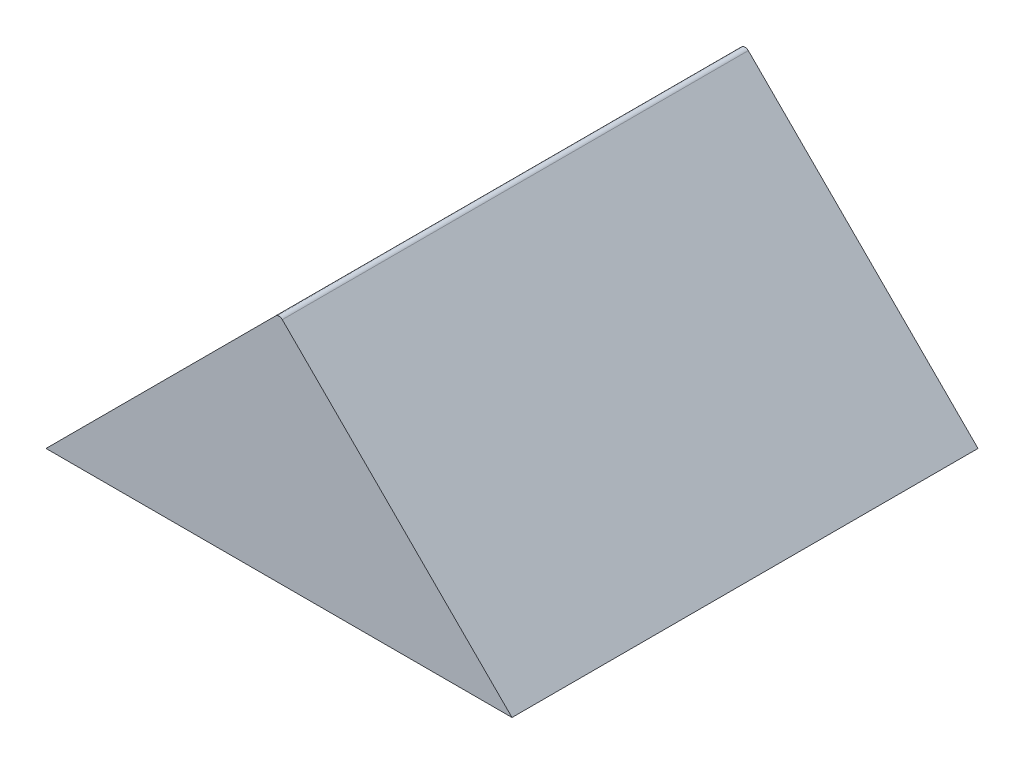
ISO-10303-21;
HEADER;
FILE_DESCRIPTION(('STEP AP214'),'2;1');
FILE_NAME('part.step','',(''),(''),'','','');
FILE_SCHEMA(('AUTOMOTIVE_DESIGN { 1 0 10303 214 1 1 1 1 }'));
ENDSEC;
DATA;
#1=APPLICATION_CONTEXT('core data for automotive mechanical design processes');
#2=APPLICATION_PROTOCOL_DEFINITION('international standard','automotive_design',2000,#1);
#3=PRODUCT_CONTEXT('',#1,'mechanical');
#4=PRODUCT('Part','Part','',(#3));
#5=PRODUCT_RELATED_PRODUCT_CATEGORY('part','',(#4));
#6=PRODUCT_DEFINITION_FORMATION('','',#4);
#7=PRODUCT_DEFINITION_CONTEXT('part definition',#1,'design');
#8=PRODUCT_DEFINITION('design','',#6,#7);
#9=PRODUCT_DEFINITION_SHAPE('','',#8);
#10=(LENGTH_UNIT() NAMED_UNIT(*) SI_UNIT(.MILLI.,.METRE.));
#11=(NAMED_UNIT(*) PLANE_ANGLE_UNIT() SI_UNIT($,.RADIAN.));
#12=(NAMED_UNIT(*) SI_UNIT($,.STERADIAN.) SOLID_ANGLE_UNIT());
#13=UNCERTAINTY_MEASURE_WITH_UNIT(LENGTH_MEASURE(1.E-05),#10,'distance_accuracy_value','');
#14=(GEOMETRIC_REPRESENTATION_CONTEXT(3) GLOBAL_UNCERTAINTY_ASSIGNED_CONTEXT((#13)) GLOBAL_UNIT_ASSIGNED_CONTEXT((#10,
#11,#12)) REPRESENTATION_CONTEXT('',''));
#15=CARTESIAN_POINT('',(0.,0.,0.));
#16=DIRECTION('',(0.,0.,1.));
#17=DIRECTION('',(1.,0.,0.));
#18=AXIS2_PLACEMENT_3D('',#15,#16,#17);
#19=CARTESIAN_POINT('',(-10.,10.,10.));
#20=DIRECTION('',(0.,0.,-1.));
#21=DIRECTION('',(-1.,0.,0.));
#22=AXIS2_PLACEMENT_3D('',#19,#20,#21);
#23=PLANE('',#22);
#24=DIRECTION('',(0.707106781186548,-0.707106781186548,0.));
#25=VECTOR('',#24,1.);
#26=CARTESIAN_POINT('',(10.,0.,10.));
#27=LINE('',#26,#25);
#28=CARTESIAN_POINT('',(0.141421356237308,9.85857864376269,10.));
#29=VERTEX_POINT('',#28);
#30=CARTESIAN_POINT('',(10.,0.,10.));
#31=VERTEX_POINT('',#30);
#32=EDGE_CURVE('E84',#29,#31,#27,.T.);
#33=ORIENTED_EDGE('',*,*,#32,.F.);
#34=CARTESIAN_POINT('',(0.,9.71715728752538,10.));
#35=DIRECTION('',(0.,0.,-1.));
#36=DIRECTION('',(-1.,0.,0.));
#37=AXIS2_PLACEMENT_3D('',#34,#35,#36);
#38=CIRCLE('',#37,0.2);
#39=CARTESIAN_POINT('',(-0.141421356237308,9.85857864376269,10.));
#40=VERTEX_POINT('',#39);
#41=EDGE_CURVE('E55',#29,#40,#38,.F.);
#42=ORIENTED_EDGE('',*,*,#41,.T.);
#43=DIRECTION('',(0.707106781186548,0.707106781186548,0.));
#44=VECTOR('',#43,1.);
#45=CARTESIAN_POINT('',(-10.,0.,10.));
#46=LINE('',#45,#44);
#47=CARTESIAN_POINT('',(-10.,0.,10.));
#48=VERTEX_POINT('',#47);
#49=EDGE_CURVE('E83',#48,#40,#46,.T.);
#50=ORIENTED_EDGE('',*,*,#49,.F.);
#51=DIRECTION('',(1.,0.,0.));
#52=VECTOR('',#51,1.);
#53=CARTESIAN_POINT('',(-10.,0.,10.));
#54=LINE('',#53,#52);
#55=EDGE_CURVE('E92',#48,#31,#54,.T.);
#56=ORIENTED_EDGE('',*,*,#55,.T.);
#57=EDGE_LOOP('',(#33,#42,#50,#56));
#58=FACE_BOUND('',#57,.T.);
#59=ADVANCED_FACE('F33',(#58),#23,.F.);
#60=CARTESIAN_POINT('',(-10.,10.,-10.));
#61=DIRECTION('',(0.,0.,1.));
#62=DIRECTION('',(1.,0.,0.));
#63=AXIS2_PLACEMENT_3D('',#60,#61,#62);
#64=PLANE('',#63);
#65=DIRECTION('',(0.707106781186548,0.707106781186548,0.));
#66=VECTOR('',#65,1.);
#67=CARTESIAN_POINT('',(-10.,0.,-10.));
#68=LINE('',#67,#66);
#69=CARTESIAN_POINT('',(-10.,0.,-10.));
#70=VERTEX_POINT('',#69);
#71=CARTESIAN_POINT('',(-0.141421356237308,9.85857864376269,-10.));
#72=VERTEX_POINT('',#71);
#73=EDGE_CURVE('E103',#70,#72,#68,.T.);
#74=ORIENTED_EDGE('',*,*,#73,.T.);
#75=CARTESIAN_POINT('',(0.,9.71715728752538,-10.));
#76=DIRECTION('',(0.,0.,1.));
#77=DIRECTION('',(1.,0.,0.));
#78=AXIS2_PLACEMENT_3D('',#75,#76,#77);
#79=CIRCLE('',#78,0.2);
#80=CARTESIAN_POINT('',(0.141421356237308,9.85857864376269,-10.));
#81=VERTEX_POINT('',#80);
#82=EDGE_CURVE('E11',#72,#81,#79,.F.);
#83=ORIENTED_EDGE('',*,*,#82,.T.);
#84=DIRECTION('',(0.707106781186548,-0.707106781186548,0.));
#85=VECTOR('',#84,1.);
#86=CARTESIAN_POINT('',(10.,0.,-10.));
#87=LINE('',#86,#85);
#88=CARTESIAN_POINT('',(10.,0.,-10.));
#89=VERTEX_POINT('',#88);
#90=EDGE_CURVE('E73',#81,#89,#87,.T.);
#91=ORIENTED_EDGE('',*,*,#90,.T.);
#92=DIRECTION('',(-1.,0.,0.));
#93=VECTOR('',#92,1.);
#94=CARTESIAN_POINT('',(-10.,0.,-10.));
#95=LINE('',#94,#93);
#96=EDGE_CURVE('E77',#89,#70,#95,.T.);
#97=ORIENTED_EDGE('',*,*,#96,.T.);
#98=EDGE_LOOP('',(#74,#83,#91,#97));
#99=FACE_BOUND('',#98,.T.);
#100=ADVANCED_FACE('F75',(#99),#64,.F.);
#101=CARTESIAN_POINT('',(0.,0.,0.));
#102=DIRECTION('',(0.,1.,0.));
#103=DIRECTION('',(0.,0.,1.));
#104=AXIS2_PLACEMENT_3D('',#101,#102,#103);
#105=PLANE('',#104);
#106=DIRECTION('',(0.,0.,1.));
#107=VECTOR('',#106,1.);
#108=CARTESIAN_POINT('',(-10.,0.,-10.));
#109=LINE('',#108,#107);
#110=EDGE_CURVE('E95',#70,#48,#109,.T.);
#111=ORIENTED_EDGE('',*,*,#110,.F.);
#112=ORIENTED_EDGE('',*,*,#96,.F.);
#113=DIRECTION('',(0.,0.,-1.));
#114=VECTOR('',#113,1.);
#115=CARTESIAN_POINT('',(10.,0.,-10.));
#116=LINE('',#115,#114);
#117=EDGE_CURVE('E87',#31,#89,#116,.T.);
#118=ORIENTED_EDGE('',*,*,#117,.F.);
#119=ORIENTED_EDGE('',*,*,#55,.F.);
#120=EDGE_LOOP('',(#111,#112,#118,#119));
#121=FACE_BOUND('',#120,.T.);
#122=ADVANCED_FACE('F94',(#121),#105,.F.);
#123=CARTESIAN_POINT('',(-10.,0.,-10.));
#124=DIRECTION('',(0.707106781186548,-0.707106781186548,0.));
#125=DIRECTION('',(0.707106781186548,0.707106781186548,0.));
#126=AXIS2_PLACEMENT_3D('',#123,#124,#125);
#127=PLANE('',#126);
#128=ORIENTED_EDGE('',*,*,#49,.T.);
#129=DIRECTION('',(0.,0.,1.));
#130=VECTOR('',#129,1.);
#131=CARTESIAN_POINT('',(-0.14142135623731,9.85857864376269,-10.));
#132=LINE('',#131,#130);
#133=EDGE_CURVE('E41',#40,#72,#132,.F.);
#134=ORIENTED_EDGE('',*,*,#133,.T.);
#135=ORIENTED_EDGE('',*,*,#73,.F.);
#136=ORIENTED_EDGE('',*,*,#110,.T.);
#137=EDGE_LOOP('',(#128,#134,#135,#136));
#138=FACE_BOUND('',#137,.T.);
#139=ADVANCED_FACE('F107',(#138),#127,.F.);
#140=CARTESIAN_POINT('',(10.,0.,-10.));
#141=DIRECTION('',(-0.707106781186548,-0.707106781186548,0.));
#142=DIRECTION('',(0.707106781186548,-0.707106781186548,0.));
#143=AXIS2_PLACEMENT_3D('',#140,#141,#142);
#144=PLANE('',#143);
#145=ORIENTED_EDGE('',*,*,#90,.F.);
#146=DIRECTION('',(0.,0.,1.));
#147=VECTOR('',#146,1.);
#148=CARTESIAN_POINT('',(0.14142135623731,9.85857864376269,-10.));
#149=LINE('',#148,#147);
#150=EDGE_CURVE('E96',#81,#29,#149,.T.);
#151=ORIENTED_EDGE('',*,*,#150,.T.);
#152=ORIENTED_EDGE('',*,*,#32,.T.);
#153=ORIENTED_EDGE('',*,*,#117,.T.);
#154=EDGE_LOOP('',(#145,#151,#152,#153));
#155=FACE_BOUND('',#154,.T.);
#156=ADVANCED_FACE('F88',(#155),#144,.F.);
#157=CARTESIAN_POINT('',(0.,9.71715728752538,-10.));
#158=DIRECTION('',(0.,0.,1.));
#159=DIRECTION('',(1.,0.,0.));
#160=AXIS2_PLACEMENT_3D('',#157,#158,#159);
#161=CYLINDRICAL_SURFACE('',#160,0.2);
#162=ORIENTED_EDGE('',*,*,#82,.F.);
#163=ORIENTED_EDGE('',*,*,#133,.F.);
#164=ORIENTED_EDGE('',*,*,#41,.F.);
#165=ORIENTED_EDGE('',*,*,#150,.F.);
#166=EDGE_LOOP('',(#162,#163,#164,#165));
#167=FACE_BOUND('',#166,.T.);
#168=ADVANCED_FACE('F35',(#167),#161,.T.);
#169=CLOSED_SHELL('',(#59,#100,#122,#139,#156,#168));
#170=MANIFOLD_SOLID_BREP('B2',#169);
#171=ADVANCED_BREP_SHAPE_REPRESENTATION('',(#18,#170),#14);
#172=SHAPE_DEFINITION_REPRESENTATION(#9,#171);
ENDSEC;
END-ISO-10303-21;
